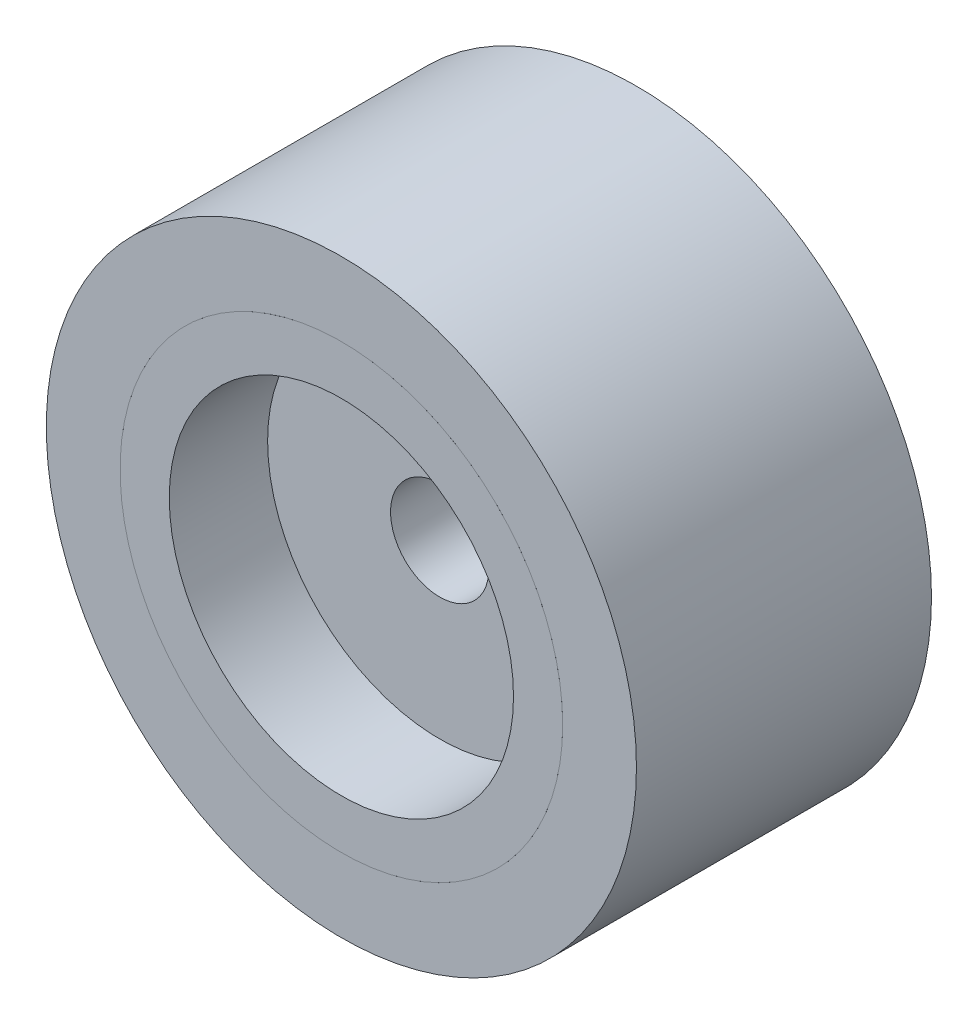
ISO-10303-21;
HEADER;
FILE_DESCRIPTION(('STEP AP214'),'2;1');
FILE_NAME('part.step','',(''),(''),'','','');
FILE_SCHEMA(('AUTOMOTIVE_DESIGN { 1 0 10303 214 1 1 1 1 }'));
ENDSEC;
DATA;
#1=APPLICATION_CONTEXT('core data for automotive mechanical design processes');
#2=APPLICATION_PROTOCOL_DEFINITION('international standard','automotive_design',2000,#1);
#3=PRODUCT_CONTEXT('',#1,'mechanical');
#4=PRODUCT('Part','Part','',(#3));
#5=PRODUCT_RELATED_PRODUCT_CATEGORY('part','',(#4));
#6=PRODUCT_DEFINITION_FORMATION('','',#4);
#7=PRODUCT_DEFINITION_CONTEXT('part definition',#1,'design');
#8=PRODUCT_DEFINITION('design','',#6,#7);
#9=PRODUCT_DEFINITION_SHAPE('','',#8);
#10=(LENGTH_UNIT() NAMED_UNIT(*) SI_UNIT(.MILLI.,.METRE.));
#11=(NAMED_UNIT(*) PLANE_ANGLE_UNIT() SI_UNIT($,.RADIAN.));
#12=(NAMED_UNIT(*) SI_UNIT($,.STERADIAN.) SOLID_ANGLE_UNIT());
#13=UNCERTAINTY_MEASURE_WITH_UNIT(LENGTH_MEASURE(1.E-05),#10,'distance_accuracy_value','');
#14=(GEOMETRIC_REPRESENTATION_CONTEXT(3) GLOBAL_UNCERTAINTY_ASSIGNED_CONTEXT((#13)) GLOBAL_UNIT_ASSIGNED_CONTEXT((#10,
#11,#12)) REPRESENTATION_CONTEXT('',''));
#15=CARTESIAN_POINT('',(0.,0.,0.));
#16=DIRECTION('',(0.,0.,1.));
#17=DIRECTION('',(1.,0.,0.));
#18=AXIS2_PLACEMENT_3D('',#15,#16,#17);
#19=CARTESIAN_POINT('',(0.,27.001,-23.999));
#20=DIRECTION('',(0.,0.,1.));
#21=DIRECTION('',(1.,0.,0.));
#22=AXIS2_PLACEMENT_3D('',#19,#20,#21);
#23=PLANE('',#22);
#24=CARTESIAN_POINT('',(0.,0.,-23.999));
#25=DIRECTION('',(0.,0.,1.));
#26=DIRECTION('',(1.,0.,0.));
#27=AXIS2_PLACEMENT_3D('',#24,#25,#26);
#28=CIRCLE('',#27,36.);
#29=CARTESIAN_POINT('',(36.,0.,-23.999));
#30=VERTEX_POINT('',#29);
#31=EDGE_CURVE('E11',#30,#30,#28,.T.);
#32=ORIENTED_EDGE('',*,*,#31,.F.);
#33=EDGE_LOOP('',(#32));
#34=FACE_BOUND('',#33,.T.);
#35=CARTESIAN_POINT('',(0.,0.,-23.999));
#36=DIRECTION('',(0.,0.,1.));
#37=DIRECTION('',(1.,0.,0.));
#38=AXIS2_PLACEMENT_3D('',#35,#36,#37);
#39=CIRCLE('',#38,27.001);
#40=CARTESIAN_POINT('',(27.001,0.,-23.999));
#41=VERTEX_POINT('',#40);
#42=EDGE_CURVE('E55',#41,#41,#39,.T.);
#43=ORIENTED_EDGE('',*,*,#42,.T.);
#44=EDGE_LOOP('',(#43));
#45=FACE_BOUND('',#44,.T.);
#46=ADVANCED_FACE('F41',(#34,#45),#23,.F.);
#47=CARTESIAN_POINT('',(0.,0.,0.));
#48=DIRECTION('',(0.,0.,1.));
#49=DIRECTION('',(1.,0.,0.));
#50=AXIS2_PLACEMENT_3D('',#47,#48,#49);
#51=CYLINDRICAL_SURFACE('',#50,36.);
#52=CARTESIAN_POINT('',(0.,0.,11.999));
#53=DIRECTION('',(0.,0.,1.));
#54=DIRECTION('',(1.,0.,0.));
#55=AXIS2_PLACEMENT_3D('',#52,#53,#54);
#56=CIRCLE('',#55,36.);
#57=CARTESIAN_POINT('',(36.,0.,11.999));
#58=VERTEX_POINT('',#57);
#59=EDGE_CURVE('E47',#58,#58,#56,.T.);
#60=ORIENTED_EDGE('',*,*,#59,.F.);
#61=EDGE_LOOP('',(#60));
#62=FACE_BOUND('',#61,.T.);
#63=ORIENTED_EDGE('',*,*,#31,.T.);
#64=EDGE_LOOP('',(#63));
#65=FACE_BOUND('',#64,.T.);
#66=ADVANCED_FACE('F70',(#62,#65),#51,.T.);
#67=CARTESIAN_POINT('',(0.,36.,11.999));
#68=DIRECTION('',(0.,0.,-1.));
#69=DIRECTION('',(-1.,0.,0.));
#70=AXIS2_PLACEMENT_3D('',#67,#68,#69);
#71=PLANE('',#70);
#72=CARTESIAN_POINT('',(0.,0.,11.999));
#73=DIRECTION('',(0.,0.,1.));
#74=DIRECTION('',(1.,0.,0.));
#75=AXIS2_PLACEMENT_3D('',#72,#73,#74);
#76=CIRCLE('',#75,27.001);
#77=CARTESIAN_POINT('',(27.001,0.,11.999));
#78=VERTEX_POINT('',#77);
#79=EDGE_CURVE('E51',#78,#78,#76,.T.);
#80=ORIENTED_EDGE('',*,*,#79,.F.);
#81=EDGE_LOOP('',(#80));
#82=FACE_BOUND('',#81,.T.);
#83=ORIENTED_EDGE('',*,*,#59,.T.);
#84=EDGE_LOOP('',(#83));
#85=FACE_BOUND('',#84,.T.);
#86=ADVANCED_FACE('F65',(#82,#85),#71,.F.);
#87=CARTESIAN_POINT('',(0.,0.,0.));
#88=DIRECTION('',(0.,0.,1.));
#89=DIRECTION('',(1.,0.,0.));
#90=AXIS2_PLACEMENT_3D('',#87,#88,#89);
#91=CYLINDRICAL_SURFACE('',#90,27.001);
#92=ORIENTED_EDGE('',*,*,#42,.F.);
#93=EDGE_LOOP('',(#92));
#94=FACE_BOUND('',#93,.T.);
#95=ORIENTED_EDGE('',*,*,#79,.T.);
#96=EDGE_LOOP('',(#95));
#97=FACE_BOUND('',#96,.T.);
#98=ADVANCED_FACE('F62',(#94,#97),#91,.F.);
#99=CLOSED_SHELL('',(#46,#66,#86,#98));
#100=MANIFOLD_SOLID_BREP('B2',#99);
#101=CARTESIAN_POINT('',(0.,0.,0.));
#102=DIRECTION('',(0.,0.,1.));
#103=DIRECTION('',(1.,0.,0.));
#104=AXIS2_PLACEMENT_3D('',#101,#102,#103);
#105=CYLINDRICAL_SURFACE('',#104,21.);
#106=CARTESIAN_POINT('',(0.,0.,0.));
#107=DIRECTION('',(0.,0.,1.));
#108=DIRECTION('',(1.,0.,0.));
#109=AXIS2_PLACEMENT_3D('',#106,#107,#108);
#110=CIRCLE('',#109,21.);
#111=CARTESIAN_POINT('',(21.,0.,0.));
#112=VERTEX_POINT('',#111);
#113=EDGE_CURVE('E40',#112,#112,#110,.T.);
#114=ORIENTED_EDGE('',*,*,#113,.F.);
#115=EDGE_LOOP('',(#114));
#116=FACE_BOUND('',#115,.T.);
#117=CARTESIAN_POINT('',(0.,0.,12.));
#118=DIRECTION('',(0.,0.,1.));
#119=DIRECTION('',(1.,0.,0.));
#120=AXIS2_PLACEMENT_3D('',#117,#118,#119);
#121=CIRCLE('',#120,21.);
#122=CARTESIAN_POINT('',(21.,0.,12.));
#123=VERTEX_POINT('',#122);
#124=EDGE_CURVE('E131',#123,#123,#121,.T.);
#125=ORIENTED_EDGE('',*,*,#124,.T.);
#126=EDGE_LOOP('',(#125));
#127=FACE_BOUND('',#126,.T.);
#128=ADVANCED_FACE('F103',(#116,#127),#105,.F.);
#129=CARTESIAN_POINT('',(0.,6.,0.));
#130=DIRECTION('',(0.,0.,-1.));
#131=DIRECTION('',(-1.,0.,0.));
#132=AXIS2_PLACEMENT_3D('',#129,#130,#131);
#133=PLANE('',#132);
#134=CARTESIAN_POINT('',(0.,0.,0.));
#135=DIRECTION('',(0.,0.,1.));
#136=DIRECTION('',(1.,0.,0.));
#137=AXIS2_PLACEMENT_3D('',#134,#135,#136);
#138=CIRCLE('',#137,6.);
#139=CARTESIAN_POINT('',(6.,0.,0.));
#140=VERTEX_POINT('',#139);
#141=EDGE_CURVE('E109',#140,#140,#138,.T.);
#142=ORIENTED_EDGE('',*,*,#141,.F.);
#143=EDGE_LOOP('',(#142));
#144=FACE_BOUND('',#143,.T.);
#145=ORIENTED_EDGE('',*,*,#113,.T.);
#146=EDGE_LOOP('',(#145));
#147=FACE_BOUND('',#146,.T.);
#148=ADVANCED_FACE('F168',(#144,#147),#133,.F.);
#149=CARTESIAN_POINT('',(0.,0.,0.));
#150=DIRECTION('',(0.,0.,1.));
#151=DIRECTION('',(1.,0.,0.));
#152=AXIS2_PLACEMENT_3D('',#149,#150,#151);
#153=CYLINDRICAL_SURFACE('',#152,6.);
#154=CARTESIAN_POINT('',(0.,0.,-12.));
#155=DIRECTION('',(0.,0.,1.));
#156=DIRECTION('',(1.,0.,0.));
#157=AXIS2_PLACEMENT_3D('',#154,#155,#156);
#158=CIRCLE('',#157,6.);
#159=CARTESIAN_POINT('',(6.,0.,-12.));
#160=VERTEX_POINT('',#159);
#161=EDGE_CURVE('E113',#160,#160,#158,.T.);
#162=ORIENTED_EDGE('',*,*,#161,.F.);
#163=EDGE_LOOP('',(#162));
#164=FACE_BOUND('',#163,.T.);
#165=ORIENTED_EDGE('',*,*,#141,.T.);
#166=EDGE_LOOP('',(#165));
#167=FACE_BOUND('',#166,.T.);
#168=ADVANCED_FACE('F163',(#164,#167),#153,.F.);
#169=CARTESIAN_POINT('',(0.,21.,-12.));
#170=DIRECTION('',(0.,0.,1.));
#171=DIRECTION('',(1.,0.,0.));
#172=AXIS2_PLACEMENT_3D('',#169,#170,#171);
#173=PLANE('',#172);
#174=CARTESIAN_POINT('',(0.,0.,-12.));
#175=DIRECTION('',(0.,0.,1.));
#176=DIRECTION('',(1.,0.,0.));
#177=AXIS2_PLACEMENT_3D('',#174,#175,#176);
#178=CIRCLE('',#177,21.);
#179=CARTESIAN_POINT('',(21.,0.,-12.));
#180=VERTEX_POINT('',#179);
#181=EDGE_CURVE('E117',#180,#180,#178,.T.);
#182=ORIENTED_EDGE('',*,*,#181,.F.);
#183=EDGE_LOOP('',(#182));
#184=FACE_BOUND('',#183,.T.);
#185=ORIENTED_EDGE('',*,*,#161,.T.);
#186=EDGE_LOOP('',(#185));
#187=FACE_BOUND('',#186,.T.);
#188=ADVANCED_FACE('F157',(#184,#187),#173,.F.);
#189=CARTESIAN_POINT('',(0.,0.,0.));
#190=DIRECTION('',(0.,0.,1.));
#191=DIRECTION('',(1.,0.,0.));
#192=AXIS2_PLACEMENT_3D('',#189,#190,#191);
#193=CYLINDRICAL_SURFACE('',#192,21.);
#194=CARTESIAN_POINT('',(0.,0.,-24.));
#195=DIRECTION('',(0.,0.,1.));
#196=DIRECTION('',(1.,0.,0.));
#197=AXIS2_PLACEMENT_3D('',#194,#195,#196);
#198=CIRCLE('',#197,21.);
#199=CARTESIAN_POINT('',(21.,0.,-24.));
#200=VERTEX_POINT('',#199);
#201=EDGE_CURVE('E122',#200,#200,#198,.T.);
#202=ORIENTED_EDGE('',*,*,#201,.F.);
#203=EDGE_LOOP('',(#202));
#204=FACE_BOUND('',#203,.T.);
#205=ORIENTED_EDGE('',*,*,#181,.T.);
#206=EDGE_LOOP('',(#205));
#207=FACE_BOUND('',#206,.T.);
#208=ADVANCED_FACE('F151',(#204,#207),#193,.F.);
#209=CARTESIAN_POINT('',(0.,27.,-24.));
#210=DIRECTION('',(0.,0.,1.));
#211=DIRECTION('',(1.,0.,0.));
#212=AXIS2_PLACEMENT_3D('',#209,#210,#211);
#213=PLANE('',#212);
#214=CARTESIAN_POINT('',(0.,0.,-24.));
#215=DIRECTION('',(0.,0.,1.));
#216=DIRECTION('',(1.,0.,0.));
#217=AXIS2_PLACEMENT_3D('',#214,#215,#216);
#218=CIRCLE('',#217,27.);
#219=CARTESIAN_POINT('',(27.,0.,-24.));
#220=VERTEX_POINT('',#219);
#221=EDGE_CURVE('E125',#220,#220,#218,.T.);
#222=ORIENTED_EDGE('',*,*,#221,.F.);
#223=EDGE_LOOP('',(#222));
#224=FACE_BOUND('',#223,.T.);
#225=ORIENTED_EDGE('',*,*,#201,.T.);
#226=EDGE_LOOP('',(#225));
#227=FACE_BOUND('',#226,.T.);
#228=ADVANCED_FACE('F145',(#224,#227),#213,.F.);
#229=CARTESIAN_POINT('',(0.,0.,0.));
#230=DIRECTION('',(0.,0.,1.));
#231=DIRECTION('',(1.,0.,0.));
#232=AXIS2_PLACEMENT_3D('',#229,#230,#231);
#233=CYLINDRICAL_SURFACE('',#232,27.);
#234=CARTESIAN_POINT('',(0.,0.,12.));
#235=DIRECTION('',(0.,0.,1.));
#236=DIRECTION('',(1.,0.,0.));
#237=AXIS2_PLACEMENT_3D('',#234,#235,#236);
#238=CIRCLE('',#237,27.);
#239=CARTESIAN_POINT('',(27.,0.,12.));
#240=VERTEX_POINT('',#239);
#241=EDGE_CURVE('E128',#240,#240,#238,.T.);
#242=ORIENTED_EDGE('',*,*,#241,.F.);
#243=EDGE_LOOP('',(#242));
#244=FACE_BOUND('',#243,.T.);
#245=ORIENTED_EDGE('',*,*,#221,.T.);
#246=EDGE_LOOP('',(#245));
#247=FACE_BOUND('',#246,.T.);
#248=ADVANCED_FACE('F139',(#244,#247),#233,.T.);
#249=CARTESIAN_POINT('',(0.,27.,12.));
#250=DIRECTION('',(0.,0.,-1.));
#251=DIRECTION('',(-1.,0.,0.));
#252=AXIS2_PLACEMENT_3D('',#249,#250,#251);
#253=PLANE('',#252);
#254=ORIENTED_EDGE('',*,*,#124,.F.);
#255=EDGE_LOOP('',(#254));
#256=FACE_BOUND('',#255,.T.);
#257=ORIENTED_EDGE('',*,*,#241,.T.);
#258=EDGE_LOOP('',(#257));
#259=FACE_BOUND('',#258,.T.);
#260=ADVANCED_FACE('F136',(#256,#259),#253,.F.);
#261=CLOSED_SHELL('',(#128,#148,#168,#188,#208,#228,#248,#260));
#262=MANIFOLD_SOLID_BREP('B6',#261);
#263=ADVANCED_BREP_SHAPE_REPRESENTATION('',(#18,#100,#262),#14);
#264=SHAPE_DEFINITION_REPRESENTATION(#9,#263);
ENDSEC;
END-ISO-10303-21;
